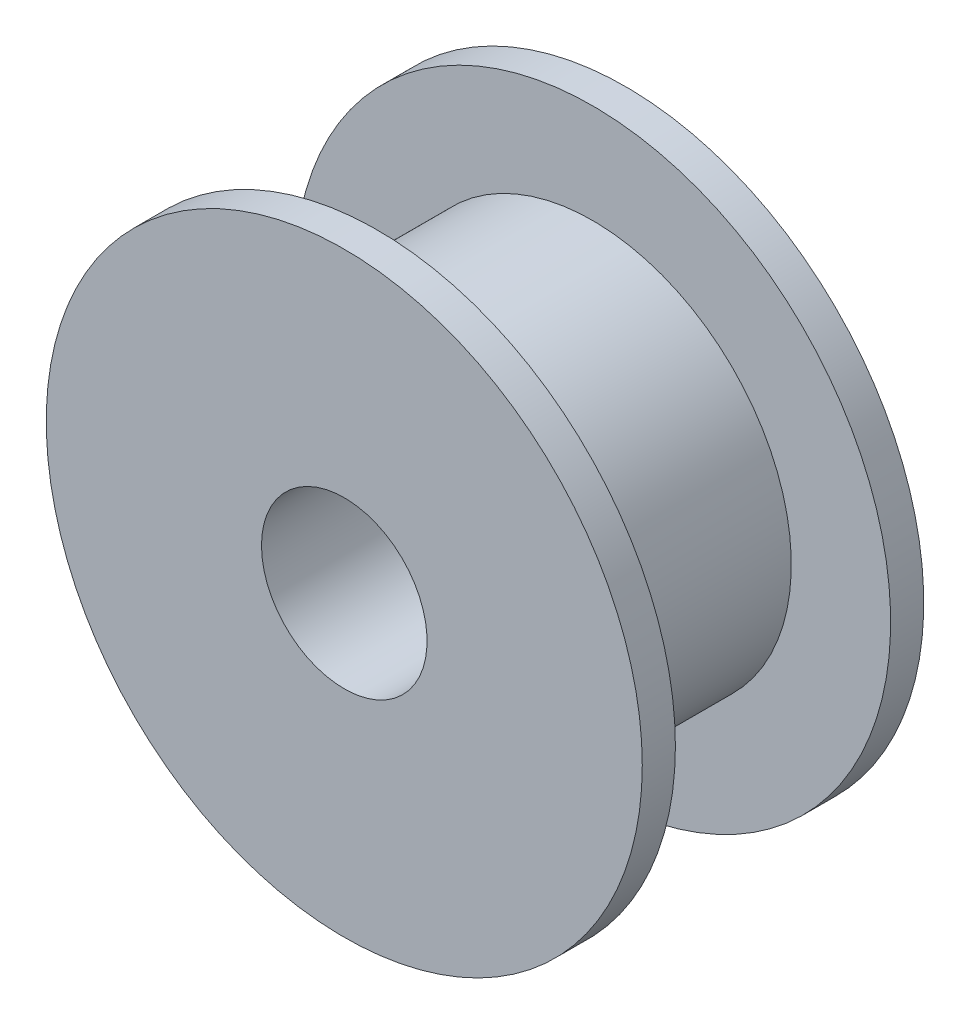
ISO-10303-21;
HEADER;
FILE_DESCRIPTION(('STEP AP214'),'2;1');
FILE_NAME('part.step','',(''),(''),'','','');
FILE_SCHEMA(('AUTOMOTIVE_DESIGN { 1 0 10303 214 1 1 1 1 }'));
ENDSEC;
DATA;
#1=APPLICATION_CONTEXT('core data for automotive mechanical design processes');
#2=APPLICATION_PROTOCOL_DEFINITION('international standard','automotive_design',2000,#1);
#3=PRODUCT_CONTEXT('',#1,'mechanical');
#4=PRODUCT('Part','Part','',(#3));
#5=PRODUCT_RELATED_PRODUCT_CATEGORY('part','',(#4));
#6=PRODUCT_DEFINITION_FORMATION('','',#4);
#7=PRODUCT_DEFINITION_CONTEXT('part definition',#1,'design');
#8=PRODUCT_DEFINITION('design','',#6,#7);
#9=PRODUCT_DEFINITION_SHAPE('','',#8);
#10=(LENGTH_UNIT() NAMED_UNIT(*) SI_UNIT(.MILLI.,.METRE.));
#11=(NAMED_UNIT(*) PLANE_ANGLE_UNIT() SI_UNIT($,.RADIAN.));
#12=(NAMED_UNIT(*) SI_UNIT($,.STERADIAN.) SOLID_ANGLE_UNIT());
#13=UNCERTAINTY_MEASURE_WITH_UNIT(LENGTH_MEASURE(1.E-05),#10,'distance_accuracy_value','');
#14=(GEOMETRIC_REPRESENTATION_CONTEXT(3) GLOBAL_UNCERTAINTY_ASSIGNED_CONTEXT((#13)) GLOBAL_UNIT_ASSIGNED_CONTEXT((#10,
#11,#12)) REPRESENTATION_CONTEXT('',''));
#15=CARTESIAN_POINT('',(0.,0.,0.));
#16=DIRECTION('',(0.,0.,1.));
#17=DIRECTION('',(1.,0.,0.));
#18=AXIS2_PLACEMENT_3D('',#15,#16,#17);
#19=CARTESIAN_POINT('',(0.,0.,6.5));
#20=DIRECTION('',(0.,0.,-1.));
#21=DIRECTION('',(-1.,0.,0.));
#22=AXIS2_PLACEMENT_3D('',#19,#20,#21);
#23=CYLINDRICAL_SURFACE('',#22,6.);
#24=CARTESIAN_POINT('',(0.,0.,6.5));
#25=DIRECTION('',(0.,0.,1.));
#26=DIRECTION('',(1.,0.,0.));
#27=AXIS2_PLACEMENT_3D('',#24,#25,#26);
#28=CIRCLE('',#27,6.);
#29=CARTESIAN_POINT('',(-6.,0.,6.5));
#30=VERTEX_POINT('',#29);
#31=EDGE_CURVE('E10',#30,#30,#28,.T.);
#32=CARTESIAN_POINT('',(0.,0.,0.));
#33=DIRECTION('',(0.,0.,-1.));
#34=DIRECTION('',(-1.,0.,0.));
#35=AXIS2_PLACEMENT_3D('',#32,#33,#34);
#36=CIRCLE('',#35,6.);
#37=CARTESIAN_POINT('',(-6.,0.,0.));
#38=VERTEX_POINT('',#37);
#39=EDGE_CURVE('E51',#38,#38,#36,.T.);
#40=CARTESIAN_POINT('',(-6.,0.,6.5));
#41=CARTESIAN_POINT('',(-6.,0.,6.43229166666667));
#42=CARTESIAN_POINT('',(-6.,0.,6.36458333333333));
#43=CARTESIAN_POINT('',(-6.,0.,6.22916666666667));
#44=CARTESIAN_POINT('',(-6.,0.,6.16145833333333));
#45=CARTESIAN_POINT('',(-6.,0.,6.02604166666667));
#46=CARTESIAN_POINT('',(-6.,0.,5.95833333333333));
#47=CARTESIAN_POINT('',(-6.,0.,5.82291666666667));
#48=CARTESIAN_POINT('',(-6.,0.,5.75520833333333));
#49=CARTESIAN_POINT('',(-6.,0.,5.61979166666667));
#50=CARTESIAN_POINT('',(-6.,0.,5.55208333333333));
#51=CARTESIAN_POINT('',(-6.,0.,5.41666666666667));
#52=CARTESIAN_POINT('',(-6.,0.,5.34895833333333));
#53=CARTESIAN_POINT('',(-6.,0.,5.21354166666667));
#54=CARTESIAN_POINT('',(-6.,0.,5.14583333333333));
#55=CARTESIAN_POINT('',(-6.,0.,5.01041666666667));
#56=CARTESIAN_POINT('',(-6.,0.,4.94270833333333));
#57=CARTESIAN_POINT('',(-6.,0.,4.80729166666667));
#58=CARTESIAN_POINT('',(-6.,0.,4.73958333333333));
#59=CARTESIAN_POINT('',(-6.,0.,4.60416666666667));
#60=CARTESIAN_POINT('',(-6.,0.,4.53645833333333));
#61=CARTESIAN_POINT('',(-6.,0.,4.40104166666667));
#62=CARTESIAN_POINT('',(-6.,0.,4.33333333333333));
#63=CARTESIAN_POINT('',(-6.,0.,4.19791666666667));
#64=CARTESIAN_POINT('',(-6.,0.,4.13020833333333));
#65=CARTESIAN_POINT('',(-6.,0.,3.99479166666667));
#66=CARTESIAN_POINT('',(-6.,0.,3.92708333333333));
#67=CARTESIAN_POINT('',(-6.,0.,3.79166666666667));
#68=CARTESIAN_POINT('',(-6.,0.,3.72395833333333));
#69=CARTESIAN_POINT('',(-6.,0.,3.58854166666667));
#70=CARTESIAN_POINT('',(-6.,0.,3.52083333333333));
#71=CARTESIAN_POINT('',(-6.,0.,3.38541666666667));
#72=CARTESIAN_POINT('',(-6.,0.,3.31770833333333));
#73=CARTESIAN_POINT('',(-6.,0.,3.18229166666667));
#74=CARTESIAN_POINT('',(-6.,0.,3.11458333333333));
#75=CARTESIAN_POINT('',(-6.,0.,2.97916666666667));
#76=CARTESIAN_POINT('',(-6.,0.,2.91145833333333));
#77=CARTESIAN_POINT('',(-6.,0.,2.77604166666667));
#78=CARTESIAN_POINT('',(-6.,0.,2.70833333333333));
#79=CARTESIAN_POINT('',(-6.,0.,2.57291666666667));
#80=CARTESIAN_POINT('',(-6.,0.,2.50520833333333));
#81=CARTESIAN_POINT('',(-6.,0.,2.36979166666667));
#82=CARTESIAN_POINT('',(-6.,0.,2.30208333333333));
#83=CARTESIAN_POINT('',(-6.,0.,2.16666666666667));
#84=CARTESIAN_POINT('',(-6.,0.,2.09895833333333));
#85=CARTESIAN_POINT('',(-6.,0.,1.96354166666667));
#86=CARTESIAN_POINT('',(-6.,0.,1.89583333333333));
#87=CARTESIAN_POINT('',(-6.,0.,1.76041666666667));
#88=CARTESIAN_POINT('',(-6.,0.,1.69270833333333));
#89=CARTESIAN_POINT('',(-6.,0.,1.55729166666667));
#90=CARTESIAN_POINT('',(-6.,0.,1.48958333333333));
#91=CARTESIAN_POINT('',(-6.,0.,1.35416666666667));
#92=CARTESIAN_POINT('',(-6.,0.,1.28645833333333));
#93=CARTESIAN_POINT('',(-6.,0.,1.15104166666667));
#94=CARTESIAN_POINT('',(-6.,0.,1.08333333333333));
#95=CARTESIAN_POINT('',(-6.,0.,0.947916666666667));
#96=CARTESIAN_POINT('',(-6.,0.,0.880208333333333));
#97=CARTESIAN_POINT('',(-6.,0.,0.744791666666667));
#98=CARTESIAN_POINT('',(-6.,0.,0.677083333333333));
#99=CARTESIAN_POINT('',(-6.,0.,0.541666666666667));
#100=CARTESIAN_POINT('',(-6.,0.,0.473958333333333));
#101=CARTESIAN_POINT('',(-6.,0.,0.338541666666667));
#102=CARTESIAN_POINT('',(-6.,0.,0.270833333333334));
#103=CARTESIAN_POINT('',(-6.,0.,0.135416666666667));
#104=CARTESIAN_POINT('',(-6.,0.,0.0677083333333334));
#105=CARTESIAN_POINT('',(-6.,0.,0.));
#106=B_SPLINE_CURVE_WITH_KNOTS('',3,(#40,#41,#42,#43,#44,#45,#46,#47,#48,#49,#50,#51,#52,#53,
#54,#55,#56,#57,#58,#59,#60,#61,#62,#63,#64,#65,#66,#67,#68,#69,#70,#71,#72,#73,#74,#75,#76,#77,
#78,#79,#80,#81,#82,#83,#84,#85,#86,#87,#88,#89,#90,#91,#92,#93,#94,#95,#96,#97,#98,#99,#100,
#101,#102,#103,#104,#105),.UNSPECIFIED.,.F.,.F.,(4,2,2,2,2,2,2,2,2,2,2,2,2,2,2,2,2,2,2,2,2,2,2,
2,2,2,2,2,2,2,2,2,4),(0.,0.203125,0.40625,0.609375000000001,0.812500000000001,1.015625,1.21875,
1.421875,1.625,1.828125,2.03125,2.234375,2.4375,2.640625,2.84375,3.046875,3.25,3.453125,3.65625,
3.859375,4.0625,4.265625,4.46875,4.671875,4.875,5.078125,5.28125,5.484375,5.6875,5.890625,
6.09375,6.296875,6.5),.UNSPECIFIED.);
#107=EDGE_CURVE('BSEAM32',#30,#38,#106,.T.);
#108=ORIENTED_EDGE('',*,*,#31,.F.);
#109=ORIENTED_EDGE('',*,*,#39,.F.);
#110=ORIENTED_EDGE('',*,*,#107,.T.);
#111=ORIENTED_EDGE('',*,*,#107,.F.);
#112=EDGE_LOOP('',(#108,#110,#109,#111));
#113=FACE_BOUND('',#112,.T.);
#114=ADVANCED_FACE('F32',(#113),#23,.T.);
#115=CARTESIAN_POINT('',(0.,0.,6.5));
#116=DIRECTION('',(0.,0.,-1.));
#117=DIRECTION('',(-1.,0.,0.));
#118=AXIS2_PLACEMENT_3D('',#115,#116,#117);
#119=CYLINDRICAL_SURFACE('',#118,2.5);
#120=CARTESIAN_POINT('',(0.,0.,7.5));
#121=DIRECTION('',(0.,0.,1.));
#122=DIRECTION('',(1.,0.,0.));
#123=AXIS2_PLACEMENT_3D('',#120,#121,#122);
#124=CIRCLE('',#123,2.5);
#125=CARTESIAN_POINT('',(-2.5,0.,7.5));
#126=VERTEX_POINT('',#125);
#127=EDGE_CURVE('E47',#126,#126,#124,.T.);
#128=CARTESIAN_POINT('',(0.,0.,-1.));
#129=DIRECTION('',(0.,0.,-1.));
#130=DIRECTION('',(-1.,0.,0.));
#131=AXIS2_PLACEMENT_3D('',#128,#129,#130);
#132=CIRCLE('',#131,2.5);
#133=CARTESIAN_POINT('',(-2.5,0.,-0.999999999999999));
#134=VERTEX_POINT('',#133);
#135=EDGE_CURVE('E58',#134,#134,#132,.T.);
#136=CARTESIAN_POINT('',(-2.5,0.,7.5));
#137=CARTESIAN_POINT('',(-2.5,0.,7.41145833333333));
#138=CARTESIAN_POINT('',(-2.5,0.,7.32291666666667));
#139=CARTESIAN_POINT('',(-2.5,0.,7.14583333333333));
#140=CARTESIAN_POINT('',(-2.5,0.,7.05729166666667));
#141=CARTESIAN_POINT('',(-2.5,0.,6.88020833333333));
#142=CARTESIAN_POINT('',(-2.5,0.,6.79166666666667));
#143=CARTESIAN_POINT('',(-2.5,0.,6.61458333333333));
#144=CARTESIAN_POINT('',(-2.5,0.,6.52604166666667));
#145=CARTESIAN_POINT('',(-2.5,0.,6.34895833333333));
#146=CARTESIAN_POINT('',(-2.5,0.,6.26041666666667));
#147=CARTESIAN_POINT('',(-2.5,0.,6.08333333333333));
#148=CARTESIAN_POINT('',(-2.5,0.,5.99479166666667));
#149=CARTESIAN_POINT('',(-2.5,0.,5.81770833333333));
#150=CARTESIAN_POINT('',(-2.5,0.,5.72916666666667));
#151=CARTESIAN_POINT('',(-2.5,0.,5.55208333333333));
#152=CARTESIAN_POINT('',(-2.5,0.,5.46354166666667));
#153=CARTESIAN_POINT('',(-2.5,0.,5.28645833333333));
#154=CARTESIAN_POINT('',(-2.5,0.,5.19791666666667));
#155=CARTESIAN_POINT('',(-2.5,0.,5.02083333333333));
#156=CARTESIAN_POINT('',(-2.5,0.,4.93229166666667));
#157=CARTESIAN_POINT('',(-2.5,0.,4.75520833333333));
#158=CARTESIAN_POINT('',(-2.5,0.,4.66666666666667));
#159=CARTESIAN_POINT('',(-2.5,0.,4.48958333333333));
#160=CARTESIAN_POINT('',(-2.5,0.,4.40104166666667));
#161=CARTESIAN_POINT('',(-2.5,0.,4.22395833333333));
#162=CARTESIAN_POINT('',(-2.5,0.,4.13541666666667));
#163=CARTESIAN_POINT('',(-2.5,0.,3.95833333333333));
#164=CARTESIAN_POINT('',(-2.5,0.,3.86979166666667));
#165=CARTESIAN_POINT('',(-2.5,0.,3.69270833333333));
#166=CARTESIAN_POINT('',(-2.5,0.,3.60416666666667));
#167=CARTESIAN_POINT('',(-2.5,0.,3.42708333333333));
#168=CARTESIAN_POINT('',(-2.5,0.,3.33854166666667));
#169=CARTESIAN_POINT('',(-2.5,0.,3.16145833333333));
#170=CARTESIAN_POINT('',(-2.5,0.,3.07291666666667));
#171=CARTESIAN_POINT('',(-2.5,0.,2.89583333333333));
#172=CARTESIAN_POINT('',(-2.5,0.,2.80729166666667));
#173=CARTESIAN_POINT('',(-2.5,0.,2.63020833333333));
#174=CARTESIAN_POINT('',(-2.5,0.,2.54166666666667));
#175=CARTESIAN_POINT('',(-2.5,0.,2.36458333333333));
#176=CARTESIAN_POINT('',(-2.5,0.,2.27604166666667));
#177=CARTESIAN_POINT('',(-2.5,0.,2.09895833333333));
#178=CARTESIAN_POINT('',(-2.5,0.,2.01041666666667));
#179=CARTESIAN_POINT('',(-2.5,0.,1.83333333333334));
#180=CARTESIAN_POINT('',(-2.5,0.,1.74479166666667));
#181=CARTESIAN_POINT('',(-2.5,0.,1.56770833333333));
#182=CARTESIAN_POINT('',(-2.5,0.,1.47916666666667));
#183=CARTESIAN_POINT('',(-2.5,0.,1.30208333333333));
#184=CARTESIAN_POINT('',(-2.5,0.,1.21354166666667));
#185=CARTESIAN_POINT('',(-2.5,0.,1.03645833333333));
#186=CARTESIAN_POINT('',(-2.5,0.,0.947916666666668));
#187=CARTESIAN_POINT('',(-2.5,0.,0.770833333333334));
#188=CARTESIAN_POINT('',(-2.5,0.,0.682291666666667));
#189=CARTESIAN_POINT('',(-2.5,0.,0.505208333333334));
#190=CARTESIAN_POINT('',(-2.5,0.,0.416666666666667));
#191=CARTESIAN_POINT('',(-2.5,0.,0.239583333333334));
#192=CARTESIAN_POINT('',(-2.5,0.,0.151041666666668));
#193=CARTESIAN_POINT('',(-2.5,0.,-0.026041666666665));
#194=CARTESIAN_POINT('',(-2.5,0.,-0.114583333333332));
#195=CARTESIAN_POINT('',(-2.5,0.,-0.291666666666665));
#196=CARTESIAN_POINT('',(-2.5,0.,-0.380208333333332));
#197=CARTESIAN_POINT('',(-2.5,0.,-0.557291666666665));
#198=CARTESIAN_POINT('',(-2.5,0.,-0.645833333333332));
#199=CARTESIAN_POINT('',(-2.5,0.,-0.822916666666666));
#200=CARTESIAN_POINT('',(-2.5,0.,-0.911458333333333));
#201=CARTESIAN_POINT('',(-2.5,0.,-0.999999999999999));
#202=B_SPLINE_CURVE_WITH_KNOTS('',3,(#136,#137,#138,#139,#140,#141,#142,#143,#144,#145,#146,
#147,#148,#149,#150,#151,#152,#153,#154,#155,#156,#157,#158,#159,#160,#161,#162,#163,#164,#165,
#166,#167,#168,#169,#170,#171,#172,#173,#174,#175,#176,#177,#178,#179,#180,#181,#182,#183,#184,
#185,#186,#187,#188,#189,#190,#191,#192,#193,#194,#195,#196,#197,#198,#199,#200,#201),
.UNSPECIFIED.,.F.,.F.,(4,2,2,2,2,2,2,2,2,2,2,2,2,2,2,2,2,2,2,2,2,2,2,2,2,2,2,2,2,2,2,2,4),(0.,
0.265624999999999,0.53125,0.796875,1.0625,1.328125,1.59375,1.859375,2.125,2.390625,2.65625,
2.921875,3.1875,3.453125,3.71875,3.984375,4.25,4.515625,4.78125,5.046875,5.3125,5.578125,
5.84375,6.109375,6.375,6.640625,6.90625,7.171875,7.4375,7.703125,7.96875,8.234375,8.5),.UNSPECIFIED.);
#203=EDGE_CURVE('BSEAM64',#126,#134,#202,.T.);
#204=ORIENTED_EDGE('',*,*,#127,.T.);
#205=ORIENTED_EDGE('',*,*,#135,.T.);
#206=ORIENTED_EDGE('',*,*,#203,.T.);
#207=ORIENTED_EDGE('',*,*,#203,.F.);
#208=EDGE_LOOP('',(#204,#206,#205,#207));
#209=FACE_BOUND('',#208,.T.);
#210=ADVANCED_FACE('F64',(#209),#119,.F.);
#211=CARTESIAN_POINT('',(0.,0.,6.5));
#212=DIRECTION('',(0.,0.,1.));
#213=DIRECTION('',(1.,0.,0.));
#214=AXIS2_PLACEMENT_3D('',#211,#212,#213);
#215=PLANE('',#214);
#216=CARTESIAN_POINT('',(0.,0.,6.5));
#217=DIRECTION('',(0.,0.,1.));
#218=DIRECTION('',(1.,0.,0.));
#219=AXIS2_PLACEMENT_3D('',#216,#217,#218);
#220=CIRCLE('',#219,9.);
#221=CARTESIAN_POINT('',(9.,0.,6.5));
#222=VERTEX_POINT('',#221);
#223=EDGE_CURVE('E42',#222,#222,#220,.T.);
#224=ORIENTED_EDGE('',*,*,#223,.F.);
#225=EDGE_LOOP('',(#224));
#226=FACE_BOUND('',#225,.T.);
#227=ORIENTED_EDGE('',*,*,#31,.T.);
#228=EDGE_LOOP('',(#227));
#229=FACE_BOUND('',#228,.T.);
#230=ADVANCED_FACE('F86',(#226,#229),#215,.F.);
#231=CARTESIAN_POINT('',(0.,0.,7.5));
#232=DIRECTION('',(0.,0.,1.));
#233=DIRECTION('',(1.,0.,0.));
#234=AXIS2_PLACEMENT_3D('',#231,#232,#233);
#235=PLANE('',#234);
#236=CARTESIAN_POINT('',(0.,0.,7.5));
#237=DIRECTION('',(0.,0.,1.));
#238=DIRECTION('',(1.,0.,0.));
#239=AXIS2_PLACEMENT_3D('',#236,#237,#238);
#240=CIRCLE('',#239,9.);
#241=CARTESIAN_POINT('',(9.,0.,7.5));
#242=VERTEX_POINT('',#241);
#243=EDGE_CURVE('E38',#242,#242,#240,.T.);
#244=ORIENTED_EDGE('',*,*,#243,.T.);
#245=EDGE_LOOP('',(#244));
#246=FACE_BOUND('',#245,.T.);
#247=ORIENTED_EDGE('',*,*,#127,.F.);
#248=EDGE_LOOP('',(#247));
#249=FACE_BOUND('',#248,.T.);
#250=ADVANCED_FACE('F94',(#246,#249),#235,.T.);
#251=CARTESIAN_POINT('',(0.,0.,7.5));
#252=DIRECTION('',(0.,0.,-1.));
#253=DIRECTION('',(-1.,0.,0.));
#254=AXIS2_PLACEMENT_3D('',#251,#252,#253);
#255=CYLINDRICAL_SURFACE('',#254,9.);
#256=ORIENTED_EDGE('',*,*,#243,.F.);
#257=EDGE_LOOP('',(#256));
#258=FACE_BOUND('',#257,.T.);
#259=ORIENTED_EDGE('',*,*,#223,.T.);
#260=EDGE_LOOP('',(#259));
#261=FACE_BOUND('',#260,.T.);
#262=ADVANCED_FACE('F78',(#258,#261),#255,.T.);
#263=CARTESIAN_POINT('',(0.,0.,0.));
#264=DIRECTION('',(0.,0.,-1.));
#265=DIRECTION('',(-1.,0.,0.));
#266=AXIS2_PLACEMENT_3D('',#263,#264,#265);
#267=PLANE('',#266);
#268=CARTESIAN_POINT('',(0.,0.,0.));
#269=DIRECTION('',(0.,0.,-1.));
#270=DIRECTION('',(-1.,0.,0.));
#271=AXIS2_PLACEMENT_3D('',#268,#269,#270);
#272=CIRCLE('',#271,9.);
#273=CARTESIAN_POINT('',(-9.,0.,0.));
#274=VERTEX_POINT('',#273);
#275=EDGE_CURVE('E55',#274,#274,#272,.T.);
#276=ORIENTED_EDGE('',*,*,#275,.F.);
#277=EDGE_LOOP('',(#276));
#278=FACE_BOUND('',#277,.T.);
#279=ORIENTED_EDGE('',*,*,#39,.T.);
#280=EDGE_LOOP('',(#279));
#281=FACE_BOUND('',#280,.T.);
#282=ADVANCED_FACE('F69',(#278,#281),#267,.F.);
#283=CARTESIAN_POINT('',(0.,0.,-1.));
#284=DIRECTION('',(0.,0.,-1.));
#285=DIRECTION('',(-1.,0.,0.));
#286=AXIS2_PLACEMENT_3D('',#283,#284,#285);
#287=PLANE('',#286);
#288=CARTESIAN_POINT('',(0.,0.,-1.));
#289=DIRECTION('',(0.,0.,-1.));
#290=DIRECTION('',(-1.,0.,0.));
#291=AXIS2_PLACEMENT_3D('',#288,#289,#290);
#292=CIRCLE('',#291,9.);
#293=CARTESIAN_POINT('',(-9.,0.,-1.));
#294=VERTEX_POINT('',#293);
#295=EDGE_CURVE('E54',#294,#294,#292,.T.);
#296=ORIENTED_EDGE('',*,*,#295,.T.);
#297=EDGE_LOOP('',(#296));
#298=FACE_BOUND('',#297,.T.);
#299=ORIENTED_EDGE('',*,*,#135,.F.);
#300=EDGE_LOOP('',(#299));
#301=FACE_BOUND('',#300,.T.);
#302=ADVANCED_FACE('F66',(#298,#301),#287,.T.);
#303=CARTESIAN_POINT('',(0.,0.,-1.));
#304=DIRECTION('',(0.,0.,1.));
#305=DIRECTION('',(1.,0.,0.));
#306=AXIS2_PLACEMENT_3D('',#303,#304,#305);
#307=CYLINDRICAL_SURFACE('',#306,9.);
#308=ORIENTED_EDGE('',*,*,#295,.F.);
#309=EDGE_LOOP('',(#308));
#310=FACE_BOUND('',#309,.T.);
#311=ORIENTED_EDGE('',*,*,#275,.T.);
#312=EDGE_LOOP('',(#311));
#313=FACE_BOUND('',#312,.T.);
#314=ADVANCED_FACE('F68',(#310,#313),#307,.T.);
#315=CLOSED_SHELL('',(#114,#210,#230,#250,#262,#282,#302,#314));
#316=MANIFOLD_SOLID_BREP('B2',#315);
#317=ADVANCED_BREP_SHAPE_REPRESENTATION('',(#18,#316),#14);
#318=SHAPE_DEFINITION_REPRESENTATION(#9,#317);
ENDSEC;
END-ISO-10303-21;
